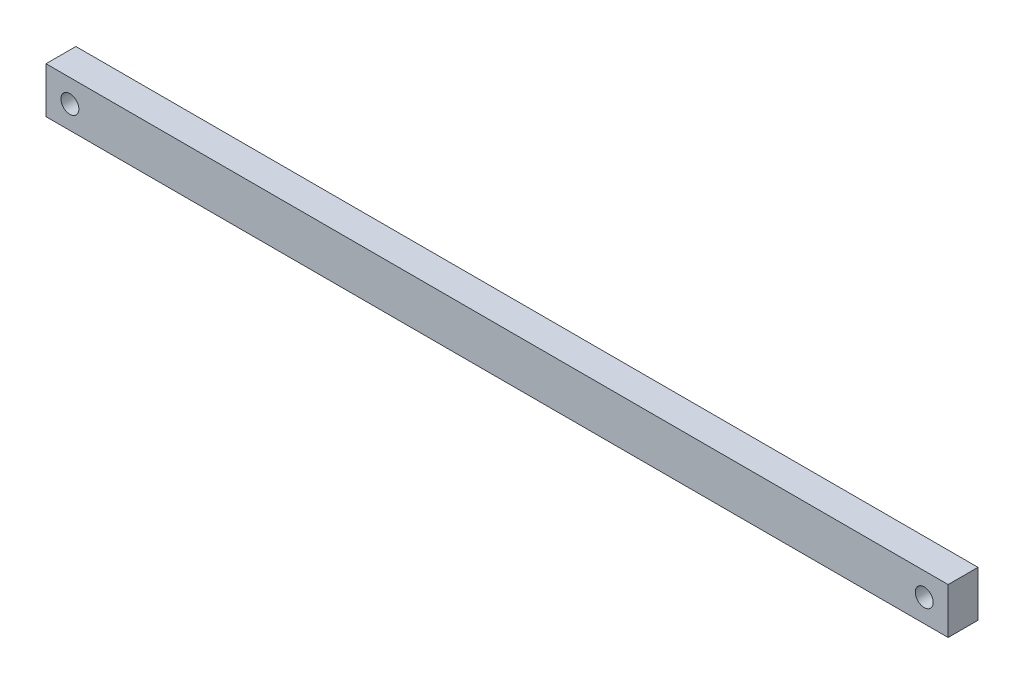
ISO-10303-21;
HEADER;
FILE_DESCRIPTION(('STEP AP214'),'2;1');
FILE_NAME('part.step','',(''),(''),'','','');
FILE_SCHEMA(('AUTOMOTIVE_DESIGN { 1 0 10303 214 1 1 1 1 }'));
ENDSEC;
DATA;
#1=APPLICATION_CONTEXT('core data for automotive mechanical design processes');
#2=APPLICATION_PROTOCOL_DEFINITION('international standard','automotive_design',2000,#1);
#3=PRODUCT_CONTEXT('',#1,'mechanical');
#4=PRODUCT('Part','Part','',(#3));
#5=PRODUCT_RELATED_PRODUCT_CATEGORY('part','',(#4));
#6=PRODUCT_DEFINITION_FORMATION('','',#4);
#7=PRODUCT_DEFINITION_CONTEXT('part definition',#1,'design');
#8=PRODUCT_DEFINITION('design','',#6,#7);
#9=PRODUCT_DEFINITION_SHAPE('','',#8);
#10=(LENGTH_UNIT() NAMED_UNIT(*) SI_UNIT(.MILLI.,.METRE.));
#11=(NAMED_UNIT(*) PLANE_ANGLE_UNIT() SI_UNIT($,.RADIAN.));
#12=(NAMED_UNIT(*) SI_UNIT($,.STERADIAN.) SOLID_ANGLE_UNIT());
#13=UNCERTAINTY_MEASURE_WITH_UNIT(LENGTH_MEASURE(1.E-05),#10,'distance_accuracy_value','');
#14=(GEOMETRIC_REPRESENTATION_CONTEXT(3) GLOBAL_UNCERTAINTY_ASSIGNED_CONTEXT((#13)) GLOBAL_UNIT_ASSIGNED_CONTEXT((#10,
#11,#12)) REPRESENTATION_CONTEXT('',''));
#15=CARTESIAN_POINT('',(0.,0.,0.));
#16=DIRECTION('',(0.,0.,1.));
#17=DIRECTION('',(1.,0.,0.));
#18=AXIS2_PLACEMENT_3D('',#15,#16,#17);
#19=CARTESIAN_POINT('',(0.,0.,25.));
#20=DIRECTION('',(0.,0.,1.));
#21=DIRECTION('',(1.,0.,0.));
#22=AXIS2_PLACEMENT_3D('',#19,#20,#21);
#23=PLANE('',#22);
#24=CARTESIAN_POINT('',(-357.5,0.,25.));
#25=DIRECTION('',(0.,0.,1.));
#26=DIRECTION('',(1.,0.,0.));
#27=AXIS2_PLACEMENT_3D('',#24,#25,#26);
#28=CIRCLE('',#27,7.50000000000001);
#29=CARTESIAN_POINT('',(-350.,0.,25.));
#30=VERTEX_POINT('',#29);
#31=EDGE_CURVE('E101',#30,#30,#28,.T.);
#32=ORIENTED_EDGE('',*,*,#31,.F.);
#33=EDGE_LOOP('',(#32));
#34=FACE_BOUND('',#33,.T.);
#35=DIRECTION('',(0.,1.,0.));
#36=VECTOR('',#35,1.);
#37=CARTESIAN_POINT('',(377.5,19.1949152542373,25.));
#38=LINE('',#37,#36);
#39=CARTESIAN_POINT('',(377.5,-19.1949152542373,25.));
#40=VERTEX_POINT('',#39);
#41=CARTESIAN_POINT('',(377.5,19.1949152542373,25.));
#42=VERTEX_POINT('',#41);
#43=EDGE_CURVE('E86',#40,#42,#38,.T.);
#44=ORIENTED_EDGE('',*,*,#43,.T.);
#45=DIRECTION('',(-1.,0.,0.));
#46=VECTOR('',#45,1.);
#47=CARTESIAN_POINT('',(-377.5,19.1949152542373,25.));
#48=LINE('',#47,#46);
#49=CARTESIAN_POINT('',(-377.5,19.1949152542373,25.));
#50=VERTEX_POINT('',#49);
#51=EDGE_CURVE('E81',#42,#50,#48,.T.);
#52=ORIENTED_EDGE('',*,*,#51,.T.);
#53=DIRECTION('',(0.,-1.,0.));
#54=VECTOR('',#53,1.);
#55=CARTESIAN_POINT('',(-377.5,19.1949152542373,25.));
#56=LINE('',#55,#54);
#57=CARTESIAN_POINT('',(-377.5,-19.1949152542373,25.));
#58=VERTEX_POINT('',#57);
#59=EDGE_CURVE('E84',#50,#58,#56,.T.);
#60=ORIENTED_EDGE('',*,*,#59,.T.);
#61=DIRECTION('',(1.,0.,0.));
#62=VECTOR('',#61,1.);
#63=CARTESIAN_POINT('',(-377.5,-19.1949152542373,25.));
#64=LINE('',#63,#62);
#65=EDGE_CURVE('E51',#58,#40,#64,.T.);
#66=ORIENTED_EDGE('',*,*,#65,.T.);
#67=EDGE_LOOP('',(#44,#52,#60,#66));
#68=FACE_BOUND('',#67,.T.);
#69=CARTESIAN_POINT('',(357.5,0.,25.));
#70=DIRECTION('',(0.,0.,1.));
#71=DIRECTION('',(1.,0.,0.));
#72=AXIS2_PLACEMENT_3D('',#69,#70,#71);
#73=CIRCLE('',#72,7.50000000000001);
#74=CARTESIAN_POINT('',(365.,0.,25.));
#75=VERTEX_POINT('',#74);
#76=EDGE_CURVE('E116',#75,#75,#73,.T.);
#77=ORIENTED_EDGE('',*,*,#76,.F.);
#78=EDGE_LOOP('',(#77));
#79=FACE_BOUND('',#78,.T.);
#80=ADVANCED_FACE('F34',(#34,#68,#79),#23,.T.);
#81=CARTESIAN_POINT('',(0.,0.,0.));
#82=DIRECTION('',(0.,0.,1.));
#83=DIRECTION('',(1.,0.,0.));
#84=AXIS2_PLACEMENT_3D('',#81,#82,#83);
#85=PLANE('',#84);
#86=DIRECTION('',(0.,1.,0.));
#87=VECTOR('',#86,1.);
#88=CARTESIAN_POINT('',(377.5,19.1949152542373,0.));
#89=LINE('',#88,#87);
#90=CARTESIAN_POINT('',(377.5,-19.1949152542373,0.));
#91=VERTEX_POINT('',#90);
#92=CARTESIAN_POINT('',(377.5,19.1949152542373,0.));
#93=VERTEX_POINT('',#92);
#94=EDGE_CURVE('E98',#91,#93,#89,.T.);
#95=ORIENTED_EDGE('',*,*,#94,.F.);
#96=DIRECTION('',(1.,0.,0.));
#97=VECTOR('',#96,1.);
#98=CARTESIAN_POINT('',(-377.5,-19.1949152542373,0.));
#99=LINE('',#98,#97);
#100=CARTESIAN_POINT('',(-377.5,-19.1949152542373,0.));
#101=VERTEX_POINT('',#100);
#102=EDGE_CURVE('E74',#101,#91,#99,.T.);
#103=ORIENTED_EDGE('',*,*,#102,.F.);
#104=DIRECTION('',(0.,-1.,0.));
#105=VECTOR('',#104,1.);
#106=CARTESIAN_POINT('',(-377.5,19.1949152542373,0.));
#107=LINE('',#106,#105);
#108=CARTESIAN_POINT('',(-377.5,19.1949152542373,0.));
#109=VERTEX_POINT('',#108);
#110=EDGE_CURVE('E68',#109,#101,#107,.T.);
#111=ORIENTED_EDGE('',*,*,#110,.F.);
#112=DIRECTION('',(-1.,0.,0.));
#113=VECTOR('',#112,1.);
#114=CARTESIAN_POINT('',(-377.5,19.1949152542373,0.));
#115=LINE('',#114,#113);
#116=EDGE_CURVE('E90',#93,#109,#115,.T.);
#117=ORIENTED_EDGE('',*,*,#116,.F.);
#118=EDGE_LOOP('',(#95,#103,#111,#117));
#119=FACE_BOUND('',#118,.T.);
#120=CARTESIAN_POINT('',(-357.5,0.,0.));
#121=DIRECTION('',(0.,0.,1.));
#122=DIRECTION('',(1.,0.,0.));
#123=AXIS2_PLACEMENT_3D('',#120,#121,#122);
#124=CIRCLE('',#123,7.50000000000001);
#125=CARTESIAN_POINT('',(-350.,0.,0.));
#126=VERTEX_POINT('',#125);
#127=EDGE_CURVE('E113',#126,#126,#124,.T.);
#128=ORIENTED_EDGE('',*,*,#127,.T.);
#129=EDGE_LOOP('',(#128));
#130=FACE_BOUND('',#129,.T.);
#131=CARTESIAN_POINT('',(357.5,0.,0.));
#132=DIRECTION('',(0.,0.,1.));
#133=DIRECTION('',(1.,0.,0.));
#134=AXIS2_PLACEMENT_3D('',#131,#132,#133);
#135=CIRCLE('',#134,7.50000000000001);
#136=CARTESIAN_POINT('',(365.,0.,0.));
#137=VERTEX_POINT('',#136);
#138=EDGE_CURVE('E119',#137,#137,#135,.T.);
#139=ORIENTED_EDGE('',*,*,#138,.T.);
#140=EDGE_LOOP('',(#139));
#141=FACE_BOUND('',#140,.T.);
#142=ADVANCED_FACE('F109',(#119,#130,#141),#85,.F.);
#143=CARTESIAN_POINT('',(377.5,19.1949152542373,25.));
#144=DIRECTION('',(-1.,0.,0.));
#145=DIRECTION('',(0.,0.,1.));
#146=AXIS2_PLACEMENT_3D('',#143,#144,#145);
#147=PLANE('',#146);
#148=ORIENTED_EDGE('',*,*,#94,.T.);
#149=DIRECTION('',(0.,0.,-1.));
#150=VECTOR('',#149,1.);
#151=CARTESIAN_POINT('',(377.5,19.1949152542373,25.));
#152=LINE('',#151,#150);
#153=EDGE_CURVE('E11',#42,#93,#152,.T.);
#154=ORIENTED_EDGE('',*,*,#153,.F.);
#155=ORIENTED_EDGE('',*,*,#43,.F.);
#156=DIRECTION('',(0.,0.,-1.));
#157=VECTOR('',#156,1.);
#158=CARTESIAN_POINT('',(377.5,-19.1949152542373,25.));
#159=LINE('',#158,#157);
#160=EDGE_CURVE('E94',#40,#91,#159,.T.);
#161=ORIENTED_EDGE('',*,*,#160,.T.);
#162=EDGE_LOOP('',(#148,#154,#155,#161));
#163=FACE_BOUND('',#162,.T.);
#164=ADVANCED_FACE('F36',(#163),#147,.F.);
#165=CARTESIAN_POINT('',(-377.5,19.1949152542373,25.));
#166=DIRECTION('',(0.,-1.,0.));
#167=DIRECTION('',(0.,0.,-1.));
#168=AXIS2_PLACEMENT_3D('',#165,#166,#167);
#169=PLANE('',#168);
#170=ORIENTED_EDGE('',*,*,#116,.T.);
#171=DIRECTION('',(0.,0.,-1.));
#172=VECTOR('',#171,1.);
#173=CARTESIAN_POINT('',(-377.5,19.1949152542373,25.));
#174=LINE('',#173,#172);
#175=EDGE_CURVE('E43',#50,#109,#174,.T.);
#176=ORIENTED_EDGE('',*,*,#175,.F.);
#177=ORIENTED_EDGE('',*,*,#51,.F.);
#178=ORIENTED_EDGE('',*,*,#153,.T.);
#179=EDGE_LOOP('',(#170,#176,#177,#178));
#180=FACE_BOUND('',#179,.T.);
#181=ADVANCED_FACE('F89',(#180),#169,.F.);
#182=CARTESIAN_POINT('',(-377.5,19.1949152542373,25.));
#183=DIRECTION('',(1.,0.,0.));
#184=DIRECTION('',(0.,0.,-1.));
#185=AXIS2_PLACEMENT_3D('',#182,#183,#184);
#186=PLANE('',#185);
#187=ORIENTED_EDGE('',*,*,#110,.T.);
#188=DIRECTION('',(0.,0.,-1.));
#189=VECTOR('',#188,1.);
#190=CARTESIAN_POINT('',(-377.5,-19.1949152542373,25.));
#191=LINE('',#190,#189);
#192=EDGE_CURVE('E91',#58,#101,#191,.T.);
#193=ORIENTED_EDGE('',*,*,#192,.F.);
#194=ORIENTED_EDGE('',*,*,#59,.F.);
#195=ORIENTED_EDGE('',*,*,#175,.T.);
#196=EDGE_LOOP('',(#187,#193,#194,#195));
#197=FACE_BOUND('',#196,.T.);
#198=ADVANCED_FACE('F92',(#197),#186,.F.);
#199=CARTESIAN_POINT('',(-377.5,-19.1949152542373,25.));
#200=DIRECTION('',(0.,1.,0.));
#201=DIRECTION('',(0.,0.,1.));
#202=AXIS2_PLACEMENT_3D('',#199,#200,#201);
#203=PLANE('',#202);
#204=ORIENTED_EDGE('',*,*,#102,.T.);
#205=ORIENTED_EDGE('',*,*,#160,.F.);
#206=ORIENTED_EDGE('',*,*,#65,.F.);
#207=ORIENTED_EDGE('',*,*,#192,.T.);
#208=EDGE_LOOP('',(#204,#205,#206,#207));
#209=FACE_BOUND('',#208,.T.);
#210=ADVANCED_FACE('F106',(#209),#203,.F.);
#211=CARTESIAN_POINT('',(-357.5,0.,25.));
#212=DIRECTION('',(0.,0.,-1.));
#213=DIRECTION('',(-1.,0.,0.));
#214=AXIS2_PLACEMENT_3D('',#211,#212,#213);
#215=CYLINDRICAL_SURFACE('',#214,7.50000000000001);
#216=ORIENTED_EDGE('',*,*,#31,.T.);
#217=EDGE_LOOP('',(#216));
#218=FACE_BOUND('',#217,.T.);
#219=ORIENTED_EDGE('',*,*,#127,.F.);
#220=EDGE_LOOP('',(#219));
#221=FACE_BOUND('',#220,.T.);
#222=ADVANCED_FACE('F136',(#218,#221),#215,.F.);
#223=CARTESIAN_POINT('',(357.5,0.,25.));
#224=DIRECTION('',(0.,0.,-1.));
#225=DIRECTION('',(-1.,0.,0.));
#226=AXIS2_PLACEMENT_3D('',#223,#224,#225);
#227=CYLINDRICAL_SURFACE('',#226,7.50000000000001);
#228=ORIENTED_EDGE('',*,*,#76,.T.);
#229=EDGE_LOOP('',(#228));
#230=FACE_BOUND('',#229,.T.);
#231=ORIENTED_EDGE('',*,*,#138,.F.);
#232=EDGE_LOOP('',(#231));
#233=FACE_BOUND('',#232,.T.);
#234=ADVANCED_FACE('F125',(#230,#233),#227,.F.);
#235=CLOSED_SHELL('',(#80,#142,#164,#181,#198,#210,#222,#234));
#236=MANIFOLD_SOLID_BREP('B2',#235);
#237=ADVANCED_BREP_SHAPE_REPRESENTATION('',(#18,#236),#14);
#238=SHAPE_DEFINITION_REPRESENTATION(#9,#237);
ENDSEC;
END-ISO-10303-21;
